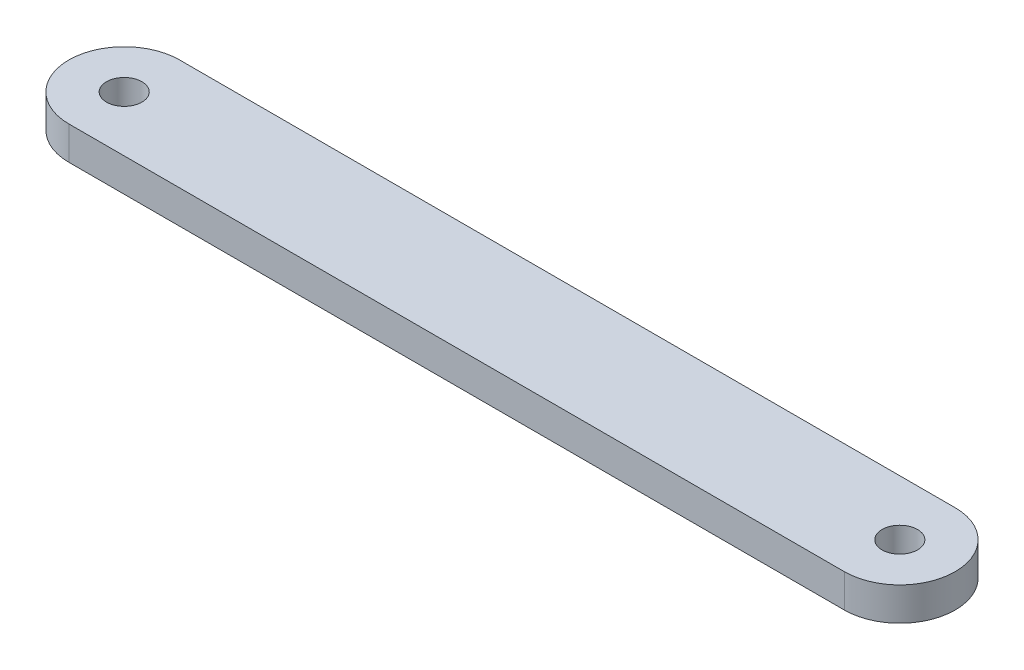
ISO-10303-21;
HEADER;
FILE_DESCRIPTION(('STEP AP214'),'2;1');
FILE_NAME('part.step','',(''),(''),'','','');
FILE_SCHEMA(('AUTOMOTIVE_DESIGN { 1 0 10303 214 1 1 1 1 }'));
ENDSEC;
DATA;
#1=APPLICATION_CONTEXT('core data for automotive mechanical design processes');
#2=APPLICATION_PROTOCOL_DEFINITION('international standard','automotive_design',2000,#1);
#3=PRODUCT_CONTEXT('',#1,'mechanical');
#4=PRODUCT('Part','Part','',(#3));
#5=PRODUCT_RELATED_PRODUCT_CATEGORY('part','',(#4));
#6=PRODUCT_DEFINITION_FORMATION('','',#4);
#7=PRODUCT_DEFINITION_CONTEXT('part definition',#1,'design');
#8=PRODUCT_DEFINITION('design','',#6,#7);
#9=PRODUCT_DEFINITION_SHAPE('','',#8);
#10=(LENGTH_UNIT() NAMED_UNIT(*) SI_UNIT(.MILLI.,.METRE.));
#11=(NAMED_UNIT(*) PLANE_ANGLE_UNIT() SI_UNIT($,.RADIAN.));
#12=(NAMED_UNIT(*) SI_UNIT($,.STERADIAN.) SOLID_ANGLE_UNIT());
#13=UNCERTAINTY_MEASURE_WITH_UNIT(LENGTH_MEASURE(1.E-05),#10,'distance_accuracy_value','');
#14=(GEOMETRIC_REPRESENTATION_CONTEXT(3) GLOBAL_UNCERTAINTY_ASSIGNED_CONTEXT((#13)) GLOBAL_UNIT_ASSIGNED_CONTEXT((#10,
#11,#12)) REPRESENTATION_CONTEXT('',''));
#15=CARTESIAN_POINT('',(0.,0.,0.));
#16=DIRECTION('',(0.,0.,1.));
#17=DIRECTION('',(1.,0.,0.));
#18=AXIS2_PLACEMENT_3D('',#15,#16,#17);
#19=CARTESIAN_POINT('',(70.,3.,0.));
#20=DIRECTION('',(0.,1.,0.));
#21=DIRECTION('',(0.,0.,1.));
#22=AXIS2_PLACEMENT_3D('',#19,#20,#21);
#23=PLANE('',#22);
#24=CARTESIAN_POINT('',(0.,3.,0.));
#25=DIRECTION('',(0.,1.,0.));
#26=DIRECTION('',(0.,0.,1.));
#27=AXIS2_PLACEMENT_3D('',#24,#25,#26);
#28=CIRCLE('',#27,1.6);
#29=CARTESIAN_POINT('',(0.,3.,1.6));
#30=VERTEX_POINT('',#29);
#31=EDGE_CURVE('E112',#30,#30,#28,.T.);
#32=ORIENTED_EDGE('',*,*,#31,.F.);
#33=EDGE_LOOP('',(#32));
#34=FACE_BOUND('',#33,.T.);
#35=CARTESIAN_POINT('',(70.,3.,0.));
#36=DIRECTION('',(0.,1.,0.));
#37=DIRECTION('',(0.,0.,1.));
#38=AXIS2_PLACEMENT_3D('',#35,#36,#37);
#39=CIRCLE('',#38,5.);
#40=CARTESIAN_POINT('',(70.,3.,5.));
#41=VERTEX_POINT('',#40);
#42=CARTESIAN_POINT('',(70.,3.,-5.));
#43=VERTEX_POINT('',#42);
#44=EDGE_CURVE('E92',#41,#43,#39,.T.);
#45=ORIENTED_EDGE('',*,*,#44,.T.);
#46=DIRECTION('',(-1.,0.,0.));
#47=VECTOR('',#46,1.);
#48=CARTESIAN_POINT('',(0.,3.,-5.));
#49=LINE('',#48,#47);
#50=CARTESIAN_POINT('',(0.,3.,-5.));
#51=VERTEX_POINT('',#50);
#52=EDGE_CURVE('E87',#43,#51,#49,.T.);
#53=ORIENTED_EDGE('',*,*,#52,.T.);
#54=CARTESIAN_POINT('',(0.,3.,0.));
#55=DIRECTION('',(0.,1.,0.));
#56=DIRECTION('',(0.,0.,1.));
#57=AXIS2_PLACEMENT_3D('',#54,#55,#56);
#58=CIRCLE('',#57,5.);
#59=CARTESIAN_POINT('',(0.,3.,5.));
#60=VERTEX_POINT('',#59);
#61=EDGE_CURVE('E90',#51,#60,#58,.T.);
#62=ORIENTED_EDGE('',*,*,#61,.T.);
#63=DIRECTION('',(1.,0.,0.));
#64=VECTOR('',#63,1.);
#65=CARTESIAN_POINT('',(0.,3.,5.));
#66=LINE('',#65,#64);
#67=EDGE_CURVE('E57',#60,#41,#66,.T.);
#68=ORIENTED_EDGE('',*,*,#67,.T.);
#69=EDGE_LOOP('',(#45,#53,#62,#68));
#70=FACE_BOUND('',#69,.T.);
#71=CARTESIAN_POINT('',(70.,3.,0.));
#72=DIRECTION('',(0.,1.,0.));
#73=DIRECTION('',(0.,0.,1.));
#74=AXIS2_PLACEMENT_3D('',#71,#72,#73);
#75=CIRCLE('',#74,1.60000000000001);
#76=CARTESIAN_POINT('',(70.,3.,1.60000000000001));
#77=VERTEX_POINT('',#76);
#78=EDGE_CURVE('E134',#77,#77,#75,.T.);
#79=ORIENTED_EDGE('',*,*,#78,.F.);
#80=EDGE_LOOP('',(#79));
#81=FACE_BOUND('',#80,.T.);
#82=ADVANCED_FACE('F39',(#34,#70,#81),#23,.T.);
#83=CARTESIAN_POINT('',(70.,0.,0.));
#84=DIRECTION('',(0.,1.,0.));
#85=DIRECTION('',(0.,0.,1.));
#86=AXIS2_PLACEMENT_3D('',#83,#84,#85);
#87=PLANE('',#86);
#88=CARTESIAN_POINT('',(70.,0.,0.));
#89=DIRECTION('',(0.,1.,0.));
#90=DIRECTION('',(0.,0.,1.));
#91=AXIS2_PLACEMENT_3D('',#88,#89,#90);
#92=CIRCLE('',#91,5.);
#93=CARTESIAN_POINT('',(70.,0.,5.));
#94=VERTEX_POINT('',#93);
#95=CARTESIAN_POINT('',(70.,0.,-5.));
#96=VERTEX_POINT('',#95);
#97=EDGE_CURVE('E108',#94,#96,#92,.T.);
#98=ORIENTED_EDGE('',*,*,#97,.F.);
#99=DIRECTION('',(1.,0.,0.));
#100=VECTOR('',#99,1.);
#101=CARTESIAN_POINT('',(0.,0.,5.));
#102=LINE('',#101,#100);
#103=CARTESIAN_POINT('',(0.,0.,5.));
#104=VERTEX_POINT('',#103);
#105=EDGE_CURVE('E80',#104,#94,#102,.T.);
#106=ORIENTED_EDGE('',*,*,#105,.F.);
#107=CARTESIAN_POINT('',(0.,0.,0.));
#108=DIRECTION('',(0.,1.,0.));
#109=DIRECTION('',(0.,0.,1.));
#110=AXIS2_PLACEMENT_3D('',#107,#108,#109);
#111=CIRCLE('',#110,5.);
#112=CARTESIAN_POINT('',(0.,0.,-5.));
#113=VERTEX_POINT('',#112);
#114=EDGE_CURVE('E74',#113,#104,#111,.T.);
#115=ORIENTED_EDGE('',*,*,#114,.F.);
#116=DIRECTION('',(-1.,0.,0.));
#117=VECTOR('',#116,1.);
#118=CARTESIAN_POINT('',(0.,0.,-5.));
#119=LINE('',#118,#117);
#120=EDGE_CURVE('E97',#96,#113,#119,.T.);
#121=ORIENTED_EDGE('',*,*,#120,.F.);
#122=EDGE_LOOP('',(#98,#106,#115,#121));
#123=FACE_BOUND('',#122,.T.);
#124=CARTESIAN_POINT('',(0.,0.,0.));
#125=DIRECTION('',(0.,1.,0.));
#126=DIRECTION('',(0.,0.,1.));
#127=AXIS2_PLACEMENT_3D('',#124,#125,#126);
#128=CIRCLE('',#127,1.6);
#129=CARTESIAN_POINT('',(0.,0.,1.6));
#130=VERTEX_POINT('',#129);
#131=EDGE_CURVE('E130',#130,#130,#128,.T.);
#132=ORIENTED_EDGE('',*,*,#131,.T.);
#133=EDGE_LOOP('',(#132));
#134=FACE_BOUND('',#133,.T.);
#135=CARTESIAN_POINT('',(70.,0.,0.));
#136=DIRECTION('',(0.,1.,0.));
#137=DIRECTION('',(0.,0.,1.));
#138=AXIS2_PLACEMENT_3D('',#135,#136,#137);
#139=CIRCLE('',#138,1.60000000000001);
#140=CARTESIAN_POINT('',(70.,0.,1.60000000000001));
#141=VERTEX_POINT('',#140);
#142=EDGE_CURVE('E138',#141,#141,#139,.T.);
#143=ORIENTED_EDGE('',*,*,#142,.T.);
#144=EDGE_LOOP('',(#143));
#145=FACE_BOUND('',#144,.T.);
#146=ADVANCED_FACE('F125',(#123,#134,#145),#87,.F.);
#147=CARTESIAN_POINT('',(70.,3.,0.));
#148=DIRECTION('',(0.,-1.,0.));
#149=DIRECTION('',(0.,0.,-1.));
#150=AXIS2_PLACEMENT_3D('',#147,#148,#149);
#151=CYLINDRICAL_SURFACE('',#150,5.);
#152=ORIENTED_EDGE('',*,*,#97,.T.);
#153=DIRECTION('',(0.,-1.,0.));
#154=VECTOR('',#153,1.);
#155=CARTESIAN_POINT('',(70.,3.,-5.));
#156=LINE('',#155,#154);
#157=EDGE_CURVE('E11',#43,#96,#156,.T.);
#158=ORIENTED_EDGE('',*,*,#157,.F.);
#159=ORIENTED_EDGE('',*,*,#44,.F.);
#160=DIRECTION('',(0.,-1.,0.));
#161=VECTOR('',#160,1.);
#162=CARTESIAN_POINT('',(70.,3.,5.));
#163=LINE('',#162,#161);
#164=EDGE_CURVE('E104',#41,#94,#163,.T.);
#165=ORIENTED_EDGE('',*,*,#164,.T.);
#166=EDGE_LOOP('',(#152,#158,#159,#165));
#167=FACE_BOUND('',#166,.T.);
#168=ADVANCED_FACE('F41',(#167),#151,.T.);
#169=CARTESIAN_POINT('',(0.,3.,-5.));
#170=DIRECTION('',(0.,0.,1.));
#171=DIRECTION('',(1.,0.,0.));
#172=AXIS2_PLACEMENT_3D('',#169,#170,#171);
#173=PLANE('',#172);
#174=ORIENTED_EDGE('',*,*,#120,.T.);
#175=DIRECTION('',(0.,-1.,0.));
#176=VECTOR('',#175,1.);
#177=CARTESIAN_POINT('',(0.,3.,-5.));
#178=LINE('',#177,#176);
#179=EDGE_CURVE('E49',#51,#113,#178,.T.);
#180=ORIENTED_EDGE('',*,*,#179,.F.);
#181=ORIENTED_EDGE('',*,*,#52,.F.);
#182=ORIENTED_EDGE('',*,*,#157,.T.);
#183=EDGE_LOOP('',(#174,#180,#181,#182));
#184=FACE_BOUND('',#183,.T.);
#185=ADVANCED_FACE('F96',(#184),#173,.F.);
#186=CARTESIAN_POINT('',(0.,3.,0.));
#187=DIRECTION('',(0.,-1.,0.));
#188=DIRECTION('',(0.,0.,-1.));
#189=AXIS2_PLACEMENT_3D('',#186,#187,#188);
#190=CYLINDRICAL_SURFACE('',#189,5.);
#191=ORIENTED_EDGE('',*,*,#114,.T.);
#192=DIRECTION('',(0.,-1.,0.));
#193=VECTOR('',#192,1.);
#194=CARTESIAN_POINT('',(0.,3.,5.));
#195=LINE('',#194,#193);
#196=EDGE_CURVE('E99',#60,#104,#195,.T.);
#197=ORIENTED_EDGE('',*,*,#196,.F.);
#198=ORIENTED_EDGE('',*,*,#61,.F.);
#199=ORIENTED_EDGE('',*,*,#179,.T.);
#200=EDGE_LOOP('',(#191,#197,#198,#199));
#201=FACE_BOUND('',#200,.T.);
#202=ADVANCED_FACE('F100',(#201),#190,.T.);
#203=CARTESIAN_POINT('',(0.,3.,5.));
#204=DIRECTION('',(0.,0.,-1.));
#205=DIRECTION('',(-1.,0.,0.));
#206=AXIS2_PLACEMENT_3D('',#203,#204,#205);
#207=PLANE('',#206);
#208=ORIENTED_EDGE('',*,*,#105,.T.);
#209=ORIENTED_EDGE('',*,*,#164,.F.);
#210=ORIENTED_EDGE('',*,*,#67,.F.);
#211=ORIENTED_EDGE('',*,*,#196,.T.);
#212=EDGE_LOOP('',(#208,#209,#210,#211));
#213=FACE_BOUND('',#212,.T.);
#214=ADVANCED_FACE('F122',(#213),#207,.F.);
#215=CARTESIAN_POINT('',(0.,3.,0.));
#216=DIRECTION('',(0.,-1.,0.));
#217=DIRECTION('',(0.,0.,-1.));
#218=AXIS2_PLACEMENT_3D('',#215,#216,#217);
#219=CYLINDRICAL_SURFACE('',#218,1.6);
#220=ORIENTED_EDGE('',*,*,#31,.T.);
#221=EDGE_LOOP('',(#220));
#222=FACE_BOUND('',#221,.T.);
#223=ORIENTED_EDGE('',*,*,#131,.F.);
#224=EDGE_LOOP('',(#223));
#225=FACE_BOUND('',#224,.T.);
#226=ADVANCED_FACE('F157',(#222,#225),#219,.F.);
#227=CARTESIAN_POINT('',(70.,3.,0.));
#228=DIRECTION('',(0.,-1.,0.));
#229=DIRECTION('',(0.,0.,-1.));
#230=AXIS2_PLACEMENT_3D('',#227,#228,#229);
#231=CYLINDRICAL_SURFACE('',#230,1.60000000000001);
#232=ORIENTED_EDGE('',*,*,#78,.T.);
#233=EDGE_LOOP('',(#232));
#234=FACE_BOUND('',#233,.T.);
#235=ORIENTED_EDGE('',*,*,#142,.F.);
#236=EDGE_LOOP('',(#235));
#237=FACE_BOUND('',#236,.T.);
#238=ADVANCED_FACE('F146',(#234,#237),#231,.F.);
#239=CLOSED_SHELL('',(#82,#146,#168,#185,#202,#214,#226,#238));
#240=MANIFOLD_SOLID_BREP('B2',#239);
#241=ADVANCED_BREP_SHAPE_REPRESENTATION('',(#18,#240),#14);
#242=SHAPE_DEFINITION_REPRESENTATION(#9,#241);
ENDSEC;
END-ISO-10303-21;
